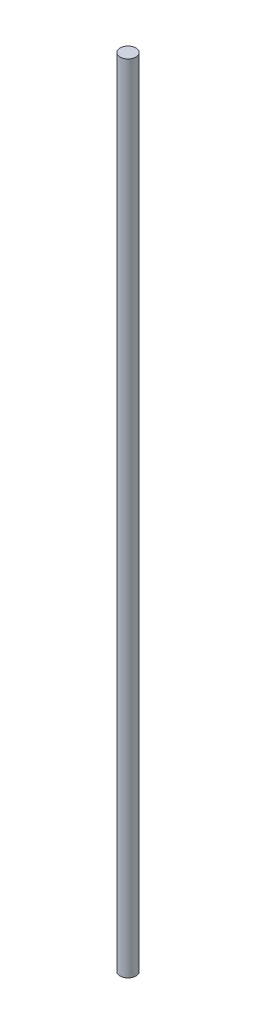
ISO-10303-21;
HEADER;
FILE_DESCRIPTION(('STEP AP214'),'2;1');
FILE_NAME('part.step','',(''),(''),'','','');
FILE_SCHEMA(('AUTOMOTIVE_DESIGN { 1 0 10303 214 1 1 1 1 }'));
ENDSEC;
DATA;
#1=APPLICATION_CONTEXT('core data for automotive mechanical design processes');
#2=APPLICATION_PROTOCOL_DEFINITION('international standard','automotive_design',2000,#1);
#3=PRODUCT_CONTEXT('',#1,'mechanical');
#4=PRODUCT('Part','Part','',(#3));
#5=PRODUCT_RELATED_PRODUCT_CATEGORY('part','',(#4));
#6=PRODUCT_DEFINITION_FORMATION('','',#4);
#7=PRODUCT_DEFINITION_CONTEXT('part definition',#1,'design');
#8=PRODUCT_DEFINITION('design','',#6,#7);
#9=PRODUCT_DEFINITION_SHAPE('','',#8);
#10=(LENGTH_UNIT() NAMED_UNIT(*) SI_UNIT(.MILLI.,.METRE.));
#11=(NAMED_UNIT(*) PLANE_ANGLE_UNIT() SI_UNIT($,.RADIAN.));
#12=(NAMED_UNIT(*) SI_UNIT($,.STERADIAN.) SOLID_ANGLE_UNIT());
#13=UNCERTAINTY_MEASURE_WITH_UNIT(LENGTH_MEASURE(1.E-05),#10,'distance_accuracy_value','');
#14=(GEOMETRIC_REPRESENTATION_CONTEXT(3) GLOBAL_UNCERTAINTY_ASSIGNED_CONTEXT((#13)) GLOBAL_UNIT_ASSIGNED_CONTEXT((#10,
#11,#12)) REPRESENTATION_CONTEXT('',''));
#15=CARTESIAN_POINT('',(0.,0.,0.));
#16=DIRECTION('',(0.,0.,1.));
#17=DIRECTION('',(1.,0.,0.));
#18=AXIS2_PLACEMENT_3D('',#15,#16,#17);
#19=CARTESIAN_POINT('',(0.,100.,0.));
#20=DIRECTION('',(0.,-1.,0.));
#21=DIRECTION('',(0.,0.,-1.));
#22=AXIS2_PLACEMENT_3D('',#19,#20,#21);
#23=CYLINDRICAL_SURFACE('',#22,1.);
#24=CARTESIAN_POINT('',(0.,100.,0.));
#25=DIRECTION('',(0.,1.,0.));
#26=DIRECTION('',(0.,0.,1.));
#27=AXIS2_PLACEMENT_3D('',#24,#25,#26);
#28=CIRCLE('',#27,1.);
#29=CARTESIAN_POINT('',(0.,100.,1.));
#30=VERTEX_POINT('',#29);
#31=EDGE_CURVE('E10',#30,#30,#28,.T.);
#32=ORIENTED_EDGE('',*,*,#31,.F.);
#33=EDGE_LOOP('',(#32));
#34=FACE_BOUND('',#33,.T.);
#35=CARTESIAN_POINT('',(0.,0.,0.));
#36=DIRECTION('',(0.,1.,0.));
#37=DIRECTION('',(0.,0.,1.));
#38=AXIS2_PLACEMENT_3D('',#35,#36,#37);
#39=CIRCLE('',#38,1.);
#40=CARTESIAN_POINT('',(0.,0.,1.));
#41=VERTEX_POINT('',#40);
#42=EDGE_CURVE('E39',#41,#41,#39,.T.);
#43=ORIENTED_EDGE('',*,*,#42,.T.);
#44=EDGE_LOOP('',(#43));
#45=FACE_BOUND('',#44,.T.);
#46=ADVANCED_FACE('F36',(#34,#45),#23,.T.);
#47=CARTESIAN_POINT('',(0.,100.,0.));
#48=DIRECTION('',(0.,1.,0.));
#49=DIRECTION('',(0.,0.,1.));
#50=AXIS2_PLACEMENT_3D('',#47,#48,#49);
#51=PLANE('',#50);
#52=ORIENTED_EDGE('',*,*,#31,.T.);
#53=EDGE_LOOP('',(#52));
#54=FACE_BOUND('',#53,.T.);
#55=ADVANCED_FACE('F51',(#54),#51,.T.);
#56=CARTESIAN_POINT('',(0.,0.,0.));
#57=DIRECTION('',(0.,1.,0.));
#58=DIRECTION('',(0.,0.,1.));
#59=AXIS2_PLACEMENT_3D('',#56,#57,#58);
#60=PLANE('',#59);
#61=ORIENTED_EDGE('',*,*,#42,.F.);
#62=EDGE_LOOP('',(#61));
#63=FACE_BOUND('',#62,.T.);
#64=ADVANCED_FACE('F49',(#63),#60,.F.);
#65=CLOSED_SHELL('',(#46,#55,#64));
#66=MANIFOLD_SOLID_BREP('B2',#65);
#67=ADVANCED_BREP_SHAPE_REPRESENTATION('',(#18,#66),#14);
#68=SHAPE_DEFINITION_REPRESENTATION(#9,#67);
ENDSEC;
END-ISO-10303-21;
